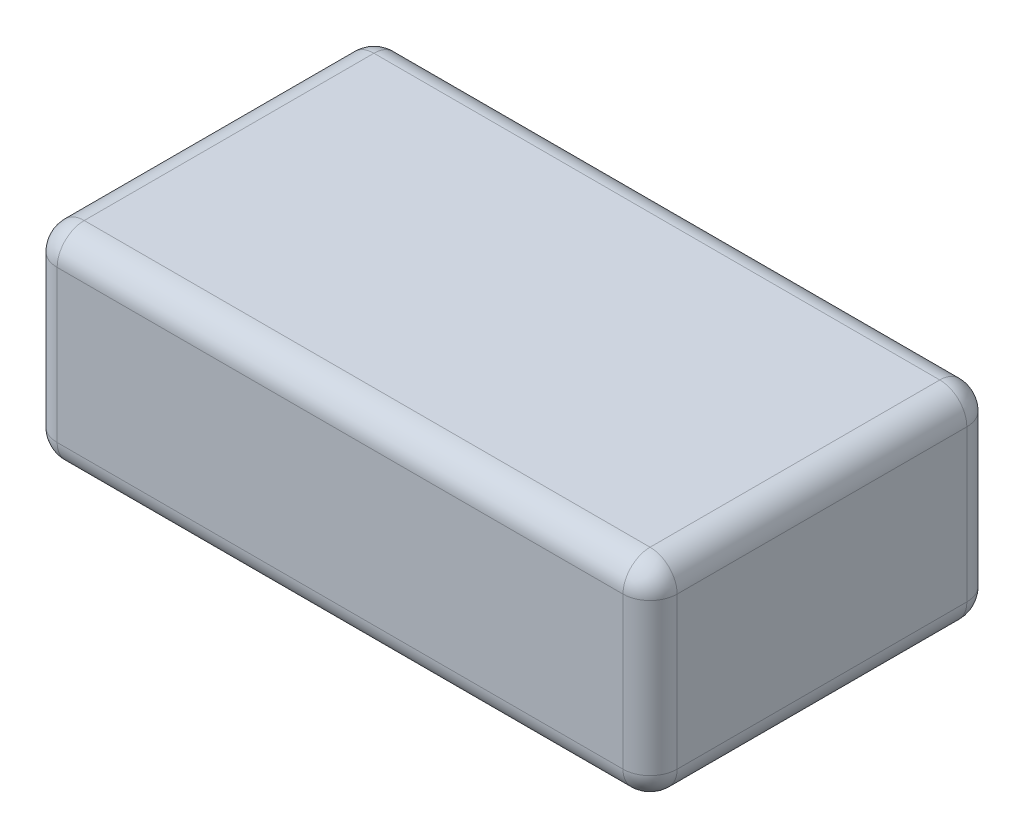
ISO-10303-21;
HEADER;
FILE_DESCRIPTION(('STEP AP214'),'2;1');
FILE_NAME('part.step','',(''),(''),'','','');
FILE_SCHEMA(('AUTOMOTIVE_DESIGN { 1 0 10303 214 1 1 1 1 }'));
ENDSEC;
DATA;
#1=APPLICATION_CONTEXT('core data for automotive mechanical design processes');
#2=APPLICATION_PROTOCOL_DEFINITION('international standard','automotive_design',2000,#1);
#3=PRODUCT_CONTEXT('',#1,'mechanical');
#4=PRODUCT('Part','Part','',(#3));
#5=PRODUCT_RELATED_PRODUCT_CATEGORY('part','',(#4));
#6=PRODUCT_DEFINITION_FORMATION('','',#4);
#7=PRODUCT_DEFINITION_CONTEXT('part definition',#1,'design');
#8=PRODUCT_DEFINITION('design','',#6,#7);
#9=PRODUCT_DEFINITION_SHAPE('','',#8);
#10=(LENGTH_UNIT() NAMED_UNIT(*) SI_UNIT(.MILLI.,.METRE.));
#11=(NAMED_UNIT(*) PLANE_ANGLE_UNIT() SI_UNIT($,.RADIAN.));
#12=(NAMED_UNIT(*) SI_UNIT($,.STERADIAN.) SOLID_ANGLE_UNIT());
#13=UNCERTAINTY_MEASURE_WITH_UNIT(LENGTH_MEASURE(1.E-05),#10,'distance_accuracy_value','');
#14=(GEOMETRIC_REPRESENTATION_CONTEXT(3) GLOBAL_UNCERTAINTY_ASSIGNED_CONTEXT((#13)) GLOBAL_UNIT_ASSIGNED_CONTEXT((#10,
#11,#12)) REPRESENTATION_CONTEXT('',''));
#15=CARTESIAN_POINT('',(0.,0.,0.));
#16=DIRECTION('',(0.,0.,1.));
#17=DIRECTION('',(1.,0.,0.));
#18=AXIS2_PLACEMENT_3D('',#15,#16,#17);
#19=CARTESIAN_POINT('',(0.,76.,0.));
#20=DIRECTION('',(1.,0.,0.));
#21=DIRECTION('',(0.,0.,-1.));
#22=AXIS2_PLACEMENT_3D('',#19,#20,#21);
#23=PLANE('',#22);
#24=DIRECTION('',(0.,0.,1.));
#25=VECTOR('',#24,1.);
#26=CARTESIAN_POINT('',(0.,66.,0.));
#27=LINE('',#26,#25);
#28=CARTESIAN_POINT('',(0.,66.,117.));
#29=VERTEX_POINT('',#28);
#30=CARTESIAN_POINT('',(0.,66.,10.));
#31=VERTEX_POINT('',#30);
#32=EDGE_CURVE('E282',#29,#31,#27,.F.);
#33=ORIENTED_EDGE('',*,*,#32,.T.);
#34=DIRECTION('',(0.,-1.,0.));
#35=VECTOR('',#34,1.);
#36=CARTESIAN_POINT('',(0.,76.,10.));
#37=LINE('',#36,#35);
#38=CARTESIAN_POINT('',(0.,9.99999999999999,10.));
#39=VERTEX_POINT('',#38);
#40=EDGE_CURVE('E226',#31,#39,#37,.T.);
#41=ORIENTED_EDGE('',*,*,#40,.T.);
#42=DIRECTION('',(0.,0.,1.));
#43=VECTOR('',#42,1.);
#44=CARTESIAN_POINT('',(0.,9.99999999999999,0.));
#45=LINE('',#44,#43);
#46=CARTESIAN_POINT('',(0.,9.99999999999999,117.));
#47=VERTEX_POINT('',#46);
#48=EDGE_CURVE('E285',#39,#47,#45,.T.);
#49=ORIENTED_EDGE('',*,*,#48,.T.);
#50=DIRECTION('',(0.,-1.,0.));
#51=VECTOR('',#50,1.);
#52=CARTESIAN_POINT('',(0.,76.,117.));
#53=LINE('',#52,#51);
#54=EDGE_CURVE('E215',#47,#29,#53,.F.);
#55=ORIENTED_EDGE('',*,*,#54,.T.);
#56=EDGE_LOOP('',(#33,#41,#49,#55));
#57=FACE_BOUND('',#56,.T.);
#58=ADVANCED_FACE('F36',(#57),#23,.F.);
#59=CARTESIAN_POINT('',(0.,76.,127.));
#60=DIRECTION('',(0.,0.,-1.));
#61=DIRECTION('',(-1.,0.,0.));
#62=AXIS2_PLACEMENT_3D('',#59,#60,#61);
#63=PLANE('',#62);
#64=DIRECTION('',(0.,-1.,0.));
#65=VECTOR('',#64,1.);
#66=CARTESIAN_POINT('',(10.,76.,127.));
#67=LINE('',#66,#65);
#68=CARTESIAN_POINT('',(10.,66.,127.));
#69=VERTEX_POINT('',#68);
#70=CARTESIAN_POINT('',(10.,9.99999999999999,127.));
#71=VERTEX_POINT('',#70);
#72=EDGE_CURVE('E217',#69,#71,#67,.T.);
#73=ORIENTED_EDGE('',*,*,#72,.T.);
#74=DIRECTION('',(1.,0.,0.));
#75=VECTOR('',#74,1.);
#76=CARTESIAN_POINT('',(0.,9.99999999999999,127.));
#77=LINE('',#76,#75);
#78=CARTESIAN_POINT('',(219.,9.99999999999999,127.));
#79=VERTEX_POINT('',#78);
#80=EDGE_CURVE('E224',#71,#79,#77,.T.);
#81=ORIENTED_EDGE('',*,*,#80,.T.);
#82=DIRECTION('',(0.,-1.,0.));
#83=VECTOR('',#82,1.);
#84=CARTESIAN_POINT('',(219.,76.,127.));
#85=LINE('',#84,#83);
#86=CARTESIAN_POINT('',(219.,66.,127.));
#87=VERTEX_POINT('',#86);
#88=EDGE_CURVE('E221',#79,#87,#85,.F.);
#89=ORIENTED_EDGE('',*,*,#88,.T.);
#90=DIRECTION('',(1.,0.,0.));
#91=VECTOR('',#90,1.);
#92=CARTESIAN_POINT('',(0.,66.,127.));
#93=LINE('',#92,#91);
#94=EDGE_CURVE('E222',#87,#69,#93,.F.);
#95=ORIENTED_EDGE('',*,*,#94,.T.);
#96=EDGE_LOOP('',(#73,#81,#89,#95));
#97=FACE_BOUND('',#96,.T.);
#98=ADVANCED_FACE('F301',(#97),#63,.F.);
#99=CARTESIAN_POINT('',(229.,76.,0.));
#100=DIRECTION('',(-1.,0.,0.));
#101=DIRECTION('',(0.,0.,1.));
#102=AXIS2_PLACEMENT_3D('',#99,#100,#101);
#103=PLANE('',#102);
#104=DIRECTION('',(0.,-1.,0.));
#105=VECTOR('',#104,1.);
#106=CARTESIAN_POINT('',(229.,76.,117.));
#107=LINE('',#106,#105);
#108=CARTESIAN_POINT('',(229.,66.,117.));
#109=VERTEX_POINT('',#108);
#110=CARTESIAN_POINT('',(229.,9.99999999999999,117.));
#111=VERTEX_POINT('',#110);
#112=EDGE_CURVE('E138',#109,#111,#107,.T.);
#113=ORIENTED_EDGE('',*,*,#112,.T.);
#114=DIRECTION('',(0.,0.,-1.));
#115=VECTOR('',#114,1.);
#116=CARTESIAN_POINT('',(229.,9.99999999999999,0.));
#117=LINE('',#116,#115);
#118=CARTESIAN_POINT('',(229.,9.99999999999999,10.));
#119=VERTEX_POINT('',#118);
#120=EDGE_CURVE('E134',#111,#119,#117,.T.);
#121=ORIENTED_EDGE('',*,*,#120,.T.);
#122=DIRECTION('',(0.,-1.,0.));
#123=VECTOR('',#122,1.);
#124=CARTESIAN_POINT('',(229.,76.,10.));
#125=LINE('',#124,#123);
#126=CARTESIAN_POINT('',(229.,66.,10.));
#127=VERTEX_POINT('',#126);
#128=EDGE_CURVE('E128',#119,#127,#125,.F.);
#129=ORIENTED_EDGE('',*,*,#128,.T.);
#130=DIRECTION('',(0.,0.,-1.));
#131=VECTOR('',#130,1.);
#132=CARTESIAN_POINT('',(229.,66.,127.));
#133=LINE('',#132,#131);
#134=EDGE_CURVE('E131',#127,#109,#133,.F.);
#135=ORIENTED_EDGE('',*,*,#134,.T.);
#136=EDGE_LOOP('',(#113,#121,#129,#135));
#137=FACE_BOUND('',#136,.T.);
#138=ADVANCED_FACE('F130',(#137),#103,.F.);
#139=CARTESIAN_POINT('',(0.,76.,0.));
#140=DIRECTION('',(0.,0.,1.));
#141=DIRECTION('',(1.,0.,0.));
#142=AXIS2_PLACEMENT_3D('',#139,#140,#141);
#143=PLANE('',#142);
#144=DIRECTION('',(-1.,0.,0.));
#145=VECTOR('',#144,1.);
#146=CARTESIAN_POINT('',(229.,66.,0.));
#147=LINE('',#146,#145);
#148=CARTESIAN_POINT('',(10.,66.,0.));
#149=VERTEX_POINT('',#148);
#150=CARTESIAN_POINT('',(219.,66.,0.));
#151=VERTEX_POINT('',#150);
#152=EDGE_CURVE('E271',#149,#151,#147,.F.);
#153=ORIENTED_EDGE('',*,*,#152,.T.);
#154=DIRECTION('',(0.,-1.,0.));
#155=VECTOR('',#154,1.);
#156=CARTESIAN_POINT('',(219.,76.,0.));
#157=LINE('',#156,#155);
#158=CARTESIAN_POINT('',(219.,9.99999999999999,0.));
#159=VERTEX_POINT('',#158);
#160=EDGE_CURVE('E154',#151,#159,#157,.T.);
#161=ORIENTED_EDGE('',*,*,#160,.T.);
#162=DIRECTION('',(-1.,0.,0.));
#163=VECTOR('',#162,1.);
#164=CARTESIAN_POINT('',(0.,9.99999999999999,0.));
#165=LINE('',#164,#163);
#166=CARTESIAN_POINT('',(10.,9.99999999999999,0.));
#167=VERTEX_POINT('',#166);
#168=EDGE_CURVE('E279',#159,#167,#165,.T.);
#169=ORIENTED_EDGE('',*,*,#168,.T.);
#170=DIRECTION('',(0.,-1.,0.));
#171=VECTOR('',#170,1.);
#172=CARTESIAN_POINT('',(10.,76.,0.));
#173=LINE('',#172,#171);
#174=EDGE_CURVE('E273',#167,#149,#173,.F.);
#175=ORIENTED_EDGE('',*,*,#174,.T.);
#176=EDGE_LOOP('',(#153,#161,#169,#175));
#177=FACE_BOUND('',#176,.T.);
#178=ADVANCED_FACE('F384',(#177),#143,.F.);
#179=CARTESIAN_POINT('',(0.,76.,0.));
#180=DIRECTION('',(0.,1.,0.));
#181=DIRECTION('',(0.,0.,1.));
#182=AXIS2_PLACEMENT_3D('',#179,#180,#181);
#183=PLANE('',#182);
#184=DIRECTION('',(1.,0.,0.));
#185=VECTOR('',#184,1.);
#186=CARTESIAN_POINT('',(229.,76.,117.));
#187=LINE('',#186,#185);
#188=CARTESIAN_POINT('',(10.,76.,117.));
#189=VERTEX_POINT('',#188);
#190=CARTESIAN_POINT('',(219.,76.,117.));
#191=VERTEX_POINT('',#190);
#192=EDGE_CURVE('E231',#189,#191,#187,.T.);
#193=ORIENTED_EDGE('',*,*,#192,.T.);
#194=DIRECTION('',(0.,0.,-1.));
#195=VECTOR('',#194,1.);
#196=CARTESIAN_POINT('',(219.,76.,0.));
#197=LINE('',#196,#195);
#198=CARTESIAN_POINT('',(219.,76.,10.));
#199=VERTEX_POINT('',#198);
#200=EDGE_CURVE('E11',#191,#199,#197,.T.);
#201=ORIENTED_EDGE('',*,*,#200,.T.);
#202=DIRECTION('',(-1.,0.,0.));
#203=VECTOR('',#202,1.);
#204=CARTESIAN_POINT('',(0.,76.,10.));
#205=LINE('',#204,#203);
#206=CARTESIAN_POINT('',(10.,76.,10.));
#207=VERTEX_POINT('',#206);
#208=EDGE_CURVE('E45',#199,#207,#205,.T.);
#209=ORIENTED_EDGE('',*,*,#208,.T.);
#210=DIRECTION('',(0.,0.,1.));
#211=VECTOR('',#210,1.);
#212=CARTESIAN_POINT('',(10.,76.,127.));
#213=LINE('',#212,#211);
#214=EDGE_CURVE('E233',#207,#189,#213,.T.);
#215=ORIENTED_EDGE('',*,*,#214,.T.);
#216=EDGE_LOOP('',(#193,#201,#209,#215));
#217=FACE_BOUND('',#216,.T.);
#218=ADVANCED_FACE('F379',(#217),#183,.T.);
#219=CARTESIAN_POINT('',(0.,0.,0.));
#220=DIRECTION('',(0.,1.,0.));
#221=DIRECTION('',(0.,0.,1.));
#222=AXIS2_PLACEMENT_3D('',#219,#220,#221);
#223=PLANE('',#222);
#224=DIRECTION('',(-1.,0.,0.));
#225=VECTOR('',#224,1.);
#226=CARTESIAN_POINT('',(0.,0.,10.));
#227=LINE('',#226,#225);
#228=CARTESIAN_POINT('',(10.,0.,10.));
#229=VERTEX_POINT('',#228);
#230=CARTESIAN_POINT('',(219.,0.,10.));
#231=VERTEX_POINT('',#230);
#232=EDGE_CURVE('E267',#229,#231,#227,.F.);
#233=ORIENTED_EDGE('',*,*,#232,.T.);
#234=DIRECTION('',(0.,0.,-1.));
#235=VECTOR('',#234,1.);
#236=CARTESIAN_POINT('',(219.,0.,0.));
#237=LINE('',#236,#235);
#238=CARTESIAN_POINT('',(219.,0.,117.));
#239=VERTEX_POINT('',#238);
#240=EDGE_CURVE('E264',#231,#239,#237,.F.);
#241=ORIENTED_EDGE('',*,*,#240,.T.);
#242=DIRECTION('',(1.,0.,0.));
#243=VECTOR('',#242,1.);
#244=CARTESIAN_POINT('',(0.,0.,117.));
#245=LINE('',#244,#243);
#246=CARTESIAN_POINT('',(10.,0.,117.));
#247=VERTEX_POINT('',#246);
#248=EDGE_CURVE('E256',#239,#247,#245,.F.);
#249=ORIENTED_EDGE('',*,*,#248,.T.);
#250=DIRECTION('',(0.,0.,1.));
#251=VECTOR('',#250,1.);
#252=CARTESIAN_POINT('',(10.,0.,0.));
#253=LINE('',#252,#251);
#254=EDGE_CURVE('E261',#247,#229,#253,.F.);
#255=ORIENTED_EDGE('',*,*,#254,.T.);
#256=EDGE_LOOP('',(#233,#241,#249,#255));
#257=FACE_BOUND('',#256,.T.);
#258=ADVANCED_FACE('F265',(#257),#223,.F.);
#259=CARTESIAN_POINT('',(10.,66.,0.));
#260=DIRECTION('',(0.,0.,-1.));
#261=DIRECTION('',(-1.,0.,0.));
#262=AXIS2_PLACEMENT_3D('',#259,#260,#261);
#263=CYLINDRICAL_SURFACE('',#262,10.);
#264=CARTESIAN_POINT('',(10.,66.,117.));
#265=DIRECTION('',(0.,0.,1.));
#266=DIRECTION('',(1.,0.,0.));
#267=AXIS2_PLACEMENT_3D('',#264,#265,#266);
#268=CIRCLE('',#267,10.);
#269=EDGE_CURVE('E40',#189,#29,#268,.T.);
#270=ORIENTED_EDGE('',*,*,#269,.F.);
#271=ORIENTED_EDGE('',*,*,#214,.F.);
#272=CARTESIAN_POINT('',(10.,66.,10.));
#273=DIRECTION('',(0.,0.,-1.));
#274=DIRECTION('',(-1.,0.,0.));
#275=AXIS2_PLACEMENT_3D('',#272,#273,#274);
#276=CIRCLE('',#275,10.);
#277=EDGE_CURVE('E195',#31,#207,#276,.T.);
#278=ORIENTED_EDGE('',*,*,#277,.F.);
#279=ORIENTED_EDGE('',*,*,#32,.F.);
#280=EDGE_LOOP('',(#270,#271,#278,#279));
#281=FACE_BOUND('',#280,.T.);
#282=ADVANCED_FACE('F38',(#281),#263,.T.);
#283=CARTESIAN_POINT('',(10.,66.,117.));
#284=DIRECTION('',(0.,0.,1.));
#285=DIRECTION('',(1.,0.,0.));
#286=AXIS2_PLACEMENT_3D('',#283,#284,#285);
#287=SPHERICAL_SURFACE('',#286,10.);
#288=CARTESIAN_POINT('',(10.,66.,117.));
#289=DIRECTION('',(-1.,0.,0.));
#290=DIRECTION('',(0.,0.,1.));
#291=AXIS2_PLACEMENT_3D('',#288,#289,#290);
#292=CIRCLE('',#291,10.);
#293=EDGE_CURVE('E190',#189,#69,#292,.F.);
#294=ORIENTED_EDGE('',*,*,#293,.F.);
#295=ORIENTED_EDGE('',*,*,#269,.T.);
#296=CARTESIAN_POINT('',(10.,66.,117.));
#297=DIRECTION('',(0.,1.,0.));
#298=DIRECTION('',(0.,0.,1.));
#299=AXIS2_PLACEMENT_3D('',#296,#297,#298);
#300=CIRCLE('',#299,10.);
#301=EDGE_CURVE('E193',#69,#29,#300,.F.);
#302=ORIENTED_EDGE('',*,*,#301,.F.);
#303=EDGE_LOOP('',(#294,#295,#302));
#304=FACE_BOUND('',#303,.T.);
#305=ADVANCED_FACE('F206',(#304),#287,.T.);
#306=CARTESIAN_POINT('',(10.,66.,10.));
#307=DIRECTION('',(0.,0.,1.));
#308=DIRECTION('',(1.,0.,0.));
#309=AXIS2_PLACEMENT_3D('',#306,#307,#308);
#310=SPHERICAL_SURFACE('',#309,10.);
#311=CARTESIAN_POINT('',(10.,66.,10.));
#312=DIRECTION('',(0.,1.,0.));
#313=DIRECTION('',(0.,0.,1.));
#314=AXIS2_PLACEMENT_3D('',#311,#312,#313);
#315=CIRCLE('',#314,10.);
#316=EDGE_CURVE('E184',#31,#149,#315,.F.);
#317=ORIENTED_EDGE('',*,*,#316,.F.);
#318=ORIENTED_EDGE('',*,*,#277,.T.);
#319=CARTESIAN_POINT('',(10.,66.,10.));
#320=DIRECTION('',(-1.,0.,0.));
#321=DIRECTION('',(0.,0.,1.));
#322=AXIS2_PLACEMENT_3D('',#319,#320,#321);
#323=CIRCLE('',#322,10.);
#324=EDGE_CURVE('E187',#149,#207,#323,.F.);
#325=ORIENTED_EDGE('',*,*,#324,.F.);
#326=EDGE_LOOP('',(#317,#318,#325));
#327=FACE_BOUND('',#326,.T.);
#328=ADVANCED_FACE('F370',(#327),#310,.T.);
#329=CARTESIAN_POINT('',(10.,76.,117.));
#330=DIRECTION('',(0.,-1.,0.));
#331=DIRECTION('',(0.,0.,-1.));
#332=AXIS2_PLACEMENT_3D('',#329,#330,#331);
#333=CYLINDRICAL_SURFACE('',#332,10.);
#334=ORIENTED_EDGE('',*,*,#301,.T.);
#335=ORIENTED_EDGE('',*,*,#54,.F.);
#336=CARTESIAN_POINT('',(10.,9.99999999999999,117.));
#337=DIRECTION('',(0.,-1.,0.));
#338=DIRECTION('',(0.,0.,-1.));
#339=AXIS2_PLACEMENT_3D('',#336,#337,#338);
#340=CIRCLE('',#339,10.);
#341=EDGE_CURVE('E178',#71,#47,#340,.T.);
#342=ORIENTED_EDGE('',*,*,#341,.F.);
#343=ORIENTED_EDGE('',*,*,#72,.F.);
#344=EDGE_LOOP('',(#334,#335,#342,#343));
#345=FACE_BOUND('',#344,.T.);
#346=ADVANCED_FACE('F213',(#345),#333,.T.);
#347=CARTESIAN_POINT('',(0.,66.,117.));
#348=DIRECTION('',(-1.,0.,0.));
#349=DIRECTION('',(0.,0.,1.));
#350=AXIS2_PLACEMENT_3D('',#347,#348,#349);
#351=CYLINDRICAL_SURFACE('',#350,10.);
#352=ORIENTED_EDGE('',*,*,#293,.T.);
#353=ORIENTED_EDGE('',*,*,#94,.F.);
#354=CARTESIAN_POINT('',(219.,66.,117.));
#355=DIRECTION('',(1.,0.,0.));
#356=DIRECTION('',(0.,0.,-1.));
#357=AXIS2_PLACEMENT_3D('',#354,#355,#356);
#358=CIRCLE('',#357,10.);
#359=EDGE_CURVE('E175',#191,#87,#358,.T.);
#360=ORIENTED_EDGE('',*,*,#359,.F.);
#361=ORIENTED_EDGE('',*,*,#192,.F.);
#362=EDGE_LOOP('',(#352,#353,#360,#361));
#363=FACE_BOUND('',#362,.T.);
#364=ADVANCED_FACE('F306',(#363),#351,.T.);
#365=CARTESIAN_POINT('',(219.,66.,0.));
#366=DIRECTION('',(0.,0.,1.));
#367=DIRECTION('',(1.,0.,0.));
#368=AXIS2_PLACEMENT_3D('',#365,#366,#367);
#369=CYLINDRICAL_SURFACE('',#368,10.);
#370=CARTESIAN_POINT('',(219.,66.,10.));
#371=DIRECTION('',(0.,0.,-1.));
#372=DIRECTION('',(-1.,0.,0.));
#373=AXIS2_PLACEMENT_3D('',#370,#371,#372);
#374=CIRCLE('',#373,10.);
#375=EDGE_CURVE('E143',#199,#127,#374,.T.);
#376=ORIENTED_EDGE('',*,*,#375,.F.);
#377=ORIENTED_EDGE('',*,*,#200,.F.);
#378=CARTESIAN_POINT('',(219.,66.,117.));
#379=DIRECTION('',(0.,0.,1.));
#380=DIRECTION('',(1.,0.,0.));
#381=AXIS2_PLACEMENT_3D('',#378,#379,#380);
#382=CIRCLE('',#381,10.);
#383=EDGE_CURVE('E145',#109,#191,#382,.T.);
#384=ORIENTED_EDGE('',*,*,#383,.F.);
#385=ORIENTED_EDGE('',*,*,#134,.F.);
#386=EDGE_LOOP('',(#376,#377,#384,#385));
#387=FACE_BOUND('',#386,.T.);
#388=ADVANCED_FACE('F141',(#387),#369,.T.);
#389=CARTESIAN_POINT('',(0.,66.,10.));
#390=DIRECTION('',(1.,0.,0.));
#391=DIRECTION('',(0.,0.,-1.));
#392=AXIS2_PLACEMENT_3D('',#389,#390,#391);
#393=CYLINDRICAL_SURFACE('',#392,10.);
#394=ORIENTED_EDGE('',*,*,#324,.T.);
#395=ORIENTED_EDGE('',*,*,#208,.F.);
#396=CARTESIAN_POINT('',(219.,66.,10.));
#397=DIRECTION('',(1.,0.,0.));
#398=DIRECTION('',(0.,0.,-1.));
#399=AXIS2_PLACEMENT_3D('',#396,#397,#398);
#400=CIRCLE('',#399,10.);
#401=EDGE_CURVE('E53',#151,#199,#400,.T.);
#402=ORIENTED_EDGE('',*,*,#401,.F.);
#403=ORIENTED_EDGE('',*,*,#152,.F.);
#404=EDGE_LOOP('',(#394,#395,#402,#403));
#405=FACE_BOUND('',#404,.T.);
#406=ADVANCED_FACE('F360',(#405),#393,.T.);
#407=CARTESIAN_POINT('',(10.,76.,10.));
#408=DIRECTION('',(0.,-1.,0.));
#409=DIRECTION('',(0.,0.,-1.));
#410=AXIS2_PLACEMENT_3D('',#407,#408,#409);
#411=CYLINDRICAL_SURFACE('',#410,10.);
#412=ORIENTED_EDGE('',*,*,#316,.T.);
#413=ORIENTED_EDGE('',*,*,#174,.F.);
#414=CARTESIAN_POINT('',(10.,9.99999999999999,10.));
#415=DIRECTION('',(0.,-1.,0.));
#416=DIRECTION('',(0.,0.,-1.));
#417=AXIS2_PLACEMENT_3D('',#414,#415,#416);
#418=CIRCLE('',#417,10.);
#419=EDGE_CURVE('E170',#39,#167,#418,.T.);
#420=ORIENTED_EDGE('',*,*,#419,.F.);
#421=ORIENTED_EDGE('',*,*,#40,.F.);
#422=EDGE_LOOP('',(#412,#413,#420,#421));
#423=FACE_BOUND('',#422,.T.);
#424=ADVANCED_FACE('F292',(#423),#411,.T.);
#425=CARTESIAN_POINT('',(10.,9.99999999999999,0.));
#426=DIRECTION('',(0.,0.,1.));
#427=DIRECTION('',(1.,0.,0.));
#428=AXIS2_PLACEMENT_3D('',#425,#426,#427);
#429=CYLINDRICAL_SURFACE('',#428,10.);
#430=CARTESIAN_POINT('',(10.,9.99999999999999,117.));
#431=DIRECTION('',(0.,0.,1.));
#432=DIRECTION('',(1.,0.,0.));
#433=AXIS2_PLACEMENT_3D('',#430,#431,#432);
#434=CIRCLE('',#433,10.);
#435=EDGE_CURVE('E181',#47,#247,#434,.T.);
#436=ORIENTED_EDGE('',*,*,#435,.F.);
#437=ORIENTED_EDGE('',*,*,#48,.F.);
#438=CARTESIAN_POINT('',(10.,10.,10.));
#439=DIRECTION('',(0.,0.,-1.));
#440=DIRECTION('',(-1.,0.,0.));
#441=AXIS2_PLACEMENT_3D('',#438,#439,#440);
#442=CIRCLE('',#441,10.);
#443=EDGE_CURVE('E168',#229,#39,#442,.T.);
#444=ORIENTED_EDGE('',*,*,#443,.F.);
#445=ORIENTED_EDGE('',*,*,#254,.F.);
#446=EDGE_LOOP('',(#436,#437,#444,#445));
#447=FACE_BOUND('',#446,.T.);
#448=ADVANCED_FACE('F298',(#447),#429,.T.);
#449=CARTESIAN_POINT('',(10.,10.,117.));
#450=DIRECTION('',(0.,0.,1.));
#451=DIRECTION('',(1.,0.,0.));
#452=AXIS2_PLACEMENT_3D('',#449,#450,#451);
#453=SPHERICAL_SURFACE('',#452,10.);
#454=ORIENTED_EDGE('',*,*,#341,.T.);
#455=ORIENTED_EDGE('',*,*,#435,.T.);
#456=CARTESIAN_POINT('',(10.,10.,117.));
#457=DIRECTION('',(-1.,0.,0.));
#458=DIRECTION('',(0.,0.,1.));
#459=AXIS2_PLACEMENT_3D('',#456,#457,#458);
#460=CIRCLE('',#459,10.);
#461=EDGE_CURVE('E159',#71,#247,#460,.F.);
#462=ORIENTED_EDGE('',*,*,#461,.F.);
#463=EDGE_LOOP('',(#454,#455,#462));
#464=FACE_BOUND('',#463,.T.);
#465=ADVANCED_FACE('F300',(#464),#453,.T.);
#466=CARTESIAN_POINT('',(219.,66.,117.));
#467=DIRECTION('',(0.,0.,1.));
#468=DIRECTION('',(1.,0.,0.));
#469=AXIS2_PLACEMENT_3D('',#466,#467,#468);
#470=SPHERICAL_SURFACE('',#469,10.);
#471=ORIENTED_EDGE('',*,*,#383,.T.);
#472=ORIENTED_EDGE('',*,*,#359,.T.);
#473=CARTESIAN_POINT('',(219.,66.,117.));
#474=DIRECTION('',(0.,1.,0.));
#475=DIRECTION('',(0.,0.,1.));
#476=AXIS2_PLACEMENT_3D('',#473,#474,#475);
#477=CIRCLE('',#476,10.);
#478=EDGE_CURVE('E155',#109,#87,#477,.F.);
#479=ORIENTED_EDGE('',*,*,#478,.F.);
#480=EDGE_LOOP('',(#471,#472,#479));
#481=FACE_BOUND('',#480,.T.);
#482=ADVANCED_FACE('F308',(#481),#470,.T.);
#483=CARTESIAN_POINT('',(219.,66.,10.));
#484=DIRECTION('',(0.,0.,1.));
#485=DIRECTION('',(1.,0.,0.));
#486=AXIS2_PLACEMENT_3D('',#483,#484,#485);
#487=SPHERICAL_SURFACE('',#486,10.);
#488=ORIENTED_EDGE('',*,*,#401,.T.);
#489=ORIENTED_EDGE('',*,*,#375,.T.);
#490=CARTESIAN_POINT('',(219.,66.,10.));
#491=DIRECTION('',(0.,1.,0.));
#492=DIRECTION('',(0.,0.,1.));
#493=AXIS2_PLACEMENT_3D('',#490,#491,#492);
#494=CIRCLE('',#493,10.);
#495=EDGE_CURVE('E149',#151,#127,#494,.F.);
#496=ORIENTED_EDGE('',*,*,#495,.F.);
#497=EDGE_LOOP('',(#488,#489,#496));
#498=FACE_BOUND('',#497,.T.);
#499=ADVANCED_FACE('F148',(#498),#487,.T.);
#500=CARTESIAN_POINT('',(10.,10.,10.));
#501=DIRECTION('',(0.,0.,1.));
#502=DIRECTION('',(1.,0.,0.));
#503=AXIS2_PLACEMENT_3D('',#500,#501,#502);
#504=SPHERICAL_SURFACE('',#503,10.);
#505=ORIENTED_EDGE('',*,*,#443,.T.);
#506=ORIENTED_EDGE('',*,*,#419,.T.);
#507=CARTESIAN_POINT('',(10.,9.99999999999999,10.));
#508=DIRECTION('',(-1.,0.,0.));
#509=DIRECTION('',(0.,0.,1.));
#510=AXIS2_PLACEMENT_3D('',#507,#508,#509);
#511=CIRCLE('',#510,10.);
#512=EDGE_CURVE('E156',#229,#167,#511,.F.);
#513=ORIENTED_EDGE('',*,*,#512,.F.);
#514=EDGE_LOOP('',(#505,#506,#513));
#515=FACE_BOUND('',#514,.T.);
#516=ADVANCED_FACE('F321',(#515),#504,.T.);
#517=CARTESIAN_POINT('',(0.,9.99999999999999,117.));
#518=DIRECTION('',(1.,0.,0.));
#519=DIRECTION('',(0.,0.,-1.));
#520=AXIS2_PLACEMENT_3D('',#517,#518,#519);
#521=CYLINDRICAL_SURFACE('',#520,10.);
#522=ORIENTED_EDGE('',*,*,#461,.T.);
#523=ORIENTED_EDGE('',*,*,#248,.F.);
#524=CARTESIAN_POINT('',(219.,9.99999999999999,117.));
#525=DIRECTION('',(1.,0.,0.));
#526=DIRECTION('',(0.,0.,-1.));
#527=AXIS2_PLACEMENT_3D('',#524,#525,#526);
#528=CIRCLE('',#527,10.);
#529=EDGE_CURVE('E162',#79,#239,#528,.T.);
#530=ORIENTED_EDGE('',*,*,#529,.F.);
#531=ORIENTED_EDGE('',*,*,#80,.F.);
#532=EDGE_LOOP('',(#522,#523,#530,#531));
#533=FACE_BOUND('',#532,.T.);
#534=ADVANCED_FACE('F258',(#533),#521,.T.);
#535=CARTESIAN_POINT('',(219.,76.,117.));
#536=DIRECTION('',(0.,-1.,0.));
#537=DIRECTION('',(0.,0.,-1.));
#538=AXIS2_PLACEMENT_3D('',#535,#536,#537);
#539=CYLINDRICAL_SURFACE('',#538,10.);
#540=ORIENTED_EDGE('',*,*,#478,.T.);
#541=ORIENTED_EDGE('',*,*,#88,.F.);
#542=CARTESIAN_POINT('',(219.,9.99999999999999,117.));
#543=DIRECTION('',(0.,-1.,0.));
#544=DIRECTION('',(0.,0.,-1.));
#545=AXIS2_PLACEMENT_3D('',#542,#543,#544);
#546=CIRCLE('',#545,10.);
#547=EDGE_CURVE('E245',#111,#79,#546,.T.);
#548=ORIENTED_EDGE('',*,*,#547,.F.);
#549=ORIENTED_EDGE('',*,*,#112,.F.);
#550=EDGE_LOOP('',(#540,#541,#548,#549));
#551=FACE_BOUND('',#550,.T.);
#552=ADVANCED_FACE('F310',(#551),#539,.T.);
#553=CARTESIAN_POINT('',(219.,76.,10.));
#554=DIRECTION('',(0.,-1.,0.));
#555=DIRECTION('',(0.,0.,-1.));
#556=AXIS2_PLACEMENT_3D('',#553,#554,#555);
#557=CYLINDRICAL_SURFACE('',#556,10.);
#558=ORIENTED_EDGE('',*,*,#495,.T.);
#559=ORIENTED_EDGE('',*,*,#128,.F.);
#560=CARTESIAN_POINT('',(219.,9.99999999999999,10.));
#561=DIRECTION('',(0.,-1.,0.));
#562=DIRECTION('',(0.,0.,-1.));
#563=AXIS2_PLACEMENT_3D('',#560,#561,#562);
#564=CIRCLE('',#563,10.);
#565=EDGE_CURVE('E242',#159,#119,#564,.T.);
#566=ORIENTED_EDGE('',*,*,#565,.F.);
#567=ORIENTED_EDGE('',*,*,#160,.F.);
#568=EDGE_LOOP('',(#558,#559,#566,#567));
#569=FACE_BOUND('',#568,.T.);
#570=ADVANCED_FACE('F152',(#569),#557,.T.);
#571=CARTESIAN_POINT('',(0.,9.99999999999999,10.));
#572=DIRECTION('',(-1.,0.,0.));
#573=DIRECTION('',(0.,0.,1.));
#574=AXIS2_PLACEMENT_3D('',#571,#572,#573);
#575=CYLINDRICAL_SURFACE('',#574,10.);
#576=ORIENTED_EDGE('',*,*,#512,.T.);
#577=ORIENTED_EDGE('',*,*,#168,.F.);
#578=CARTESIAN_POINT('',(219.,10.,10.));
#579=DIRECTION('',(1.,0.,0.));
#580=DIRECTION('',(0.,0.,-1.));
#581=AXIS2_PLACEMENT_3D('',#578,#579,#580);
#582=CIRCLE('',#581,10.);
#583=EDGE_CURVE('E240',#231,#159,#582,.T.);
#584=ORIENTED_EDGE('',*,*,#583,.F.);
#585=ORIENTED_EDGE('',*,*,#232,.F.);
#586=EDGE_LOOP('',(#576,#577,#584,#585));
#587=FACE_BOUND('',#586,.T.);
#588=ADVANCED_FACE('F319',(#587),#575,.T.);
#589=CARTESIAN_POINT('',(219.,10.,117.));
#590=DIRECTION('',(0.,0.,1.));
#591=DIRECTION('',(1.,0.,0.));
#592=AXIS2_PLACEMENT_3D('',#589,#590,#591);
#593=SPHERICAL_SURFACE('',#592,10.);
#594=ORIENTED_EDGE('',*,*,#547,.T.);
#595=ORIENTED_EDGE('',*,*,#529,.T.);
#596=CARTESIAN_POINT('',(219.,10.,117.));
#597=DIRECTION('',(0.,0.,1.));
#598=DIRECTION('',(1.,0.,0.));
#599=AXIS2_PLACEMENT_3D('',#596,#597,#598);
#600=CIRCLE('',#599,10.);
#601=EDGE_CURVE('E238',#111,#239,#600,.F.);
#602=ORIENTED_EDGE('',*,*,#601,.F.);
#603=EDGE_LOOP('',(#594,#595,#602));
#604=FACE_BOUND('',#603,.T.);
#605=ADVANCED_FACE('F251',(#604),#593,.T.);
#606=CARTESIAN_POINT('',(219.,10.,10.));
#607=DIRECTION('',(0.,0.,1.));
#608=DIRECTION('',(1.,0.,0.));
#609=AXIS2_PLACEMENT_3D('',#606,#607,#608);
#610=SPHERICAL_SURFACE('',#609,10.);
#611=ORIENTED_EDGE('',*,*,#583,.T.);
#612=ORIENTED_EDGE('',*,*,#565,.T.);
#613=CARTESIAN_POINT('',(219.,9.99999999999999,10.));
#614=DIRECTION('',(0.,0.,-1.));
#615=DIRECTION('',(-1.,0.,0.));
#616=AXIS2_PLACEMENT_3D('',#613,#614,#615);
#617=CIRCLE('',#616,10.);
#618=EDGE_CURVE('E236',#231,#119,#617,.F.);
#619=ORIENTED_EDGE('',*,*,#618,.F.);
#620=EDGE_LOOP('',(#611,#612,#619));
#621=FACE_BOUND('',#620,.T.);
#622=ADVANCED_FACE('F334',(#621),#610,.T.);
#623=CARTESIAN_POINT('',(219.,9.99999999999999,0.));
#624=DIRECTION('',(0.,0.,-1.));
#625=DIRECTION('',(-1.,0.,0.));
#626=AXIS2_PLACEMENT_3D('',#623,#624,#625);
#627=CYLINDRICAL_SURFACE('',#626,10.);
#628=ORIENTED_EDGE('',*,*,#601,.T.);
#629=ORIENTED_EDGE('',*,*,#240,.F.);
#630=ORIENTED_EDGE('',*,*,#618,.T.);
#631=ORIENTED_EDGE('',*,*,#120,.F.);
#632=EDGE_LOOP('',(#628,#629,#630,#631));
#633=FACE_BOUND('',#632,.T.);
#634=ADVANCED_FACE('F331',(#633),#627,.T.);
#635=CLOSED_SHELL('',(#58,#98,#138,#178,#218,#258,#282,#305,#328,#346,#364,#388,#406,#424,#448,
#465,#482,#499,#516,#534,#552,#570,#588,#605,#622,#634));
#636=MANIFOLD_SOLID_BREP('B2',#635);
#637=ADVANCED_BREP_SHAPE_REPRESENTATION('',(#18,#636),#14);
#638=SHAPE_DEFINITION_REPRESENTATION(#9,#637);
ENDSEC;
END-ISO-10303-21;
